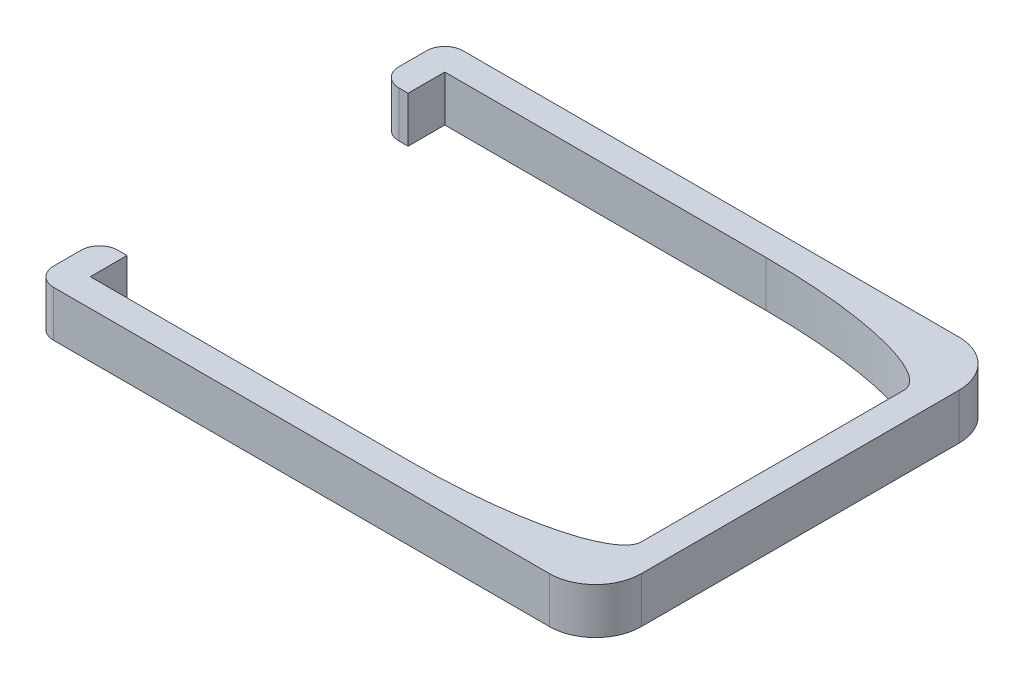
ISO-10303-21;
HEADER;
FILE_DESCRIPTION(('STEP AP214'),'2;1');
FILE_NAME('part.step','',(''),(''),'','','');
FILE_SCHEMA(('AUTOMOTIVE_DESIGN { 1 0 10303 214 1 1 1 1 }'));
ENDSEC;
DATA;
#1=APPLICATION_CONTEXT('core data for automotive mechanical design processes');
#2=APPLICATION_PROTOCOL_DEFINITION('international standard','automotive_design',2000,#1);
#3=PRODUCT_CONTEXT('',#1,'mechanical');
#4=PRODUCT('Part','Part','',(#3));
#5=PRODUCT_RELATED_PRODUCT_CATEGORY('part','',(#4));
#6=PRODUCT_DEFINITION_FORMATION('','',#4);
#7=PRODUCT_DEFINITION_CONTEXT('part definition',#1,'design');
#8=PRODUCT_DEFINITION('design','',#6,#7);
#9=PRODUCT_DEFINITION_SHAPE('','',#8);
#10=(LENGTH_UNIT() NAMED_UNIT(*) SI_UNIT(.MILLI.,.METRE.));
#11=(NAMED_UNIT(*) PLANE_ANGLE_UNIT() SI_UNIT($,.RADIAN.));
#12=(NAMED_UNIT(*) SI_UNIT($,.STERADIAN.) SOLID_ANGLE_UNIT());
#13=UNCERTAINTY_MEASURE_WITH_UNIT(LENGTH_MEASURE(1.E-05),#10,'distance_accuracy_value','');
#14=(GEOMETRIC_REPRESENTATION_CONTEXT(3) GLOBAL_UNCERTAINTY_ASSIGNED_CONTEXT((#13)) GLOBAL_UNIT_ASSIGNED_CONTEXT((#10,
#11,#12)) REPRESENTATION_CONTEXT('',''));
#15=CARTESIAN_POINT('',(0.,0.,0.));
#16=DIRECTION('',(0.,0.,1.));
#17=DIRECTION('',(1.,0.,0.));
#18=AXIS2_PLACEMENT_3D('',#15,#16,#17);
#19=CARTESIAN_POINT('',(0.,5.,4.));
#20=DIRECTION('',(-1.,0.,0.));
#21=DIRECTION('',(0.,0.,1.));
#22=AXIS2_PLACEMENT_3D('',#19,#20,#21);
#23=PLANE('',#22);
#24=DIRECTION('',(0.,0.,-1.));
#25=VECTOR('',#24,1.);
#26=CARTESIAN_POINT('',(0.,0.,4.));
#27=LINE('',#26,#25);
#28=CARTESIAN_POINT('',(0.,0.,4.));
#29=VERTEX_POINT('',#28);
#30=CARTESIAN_POINT('',(0.,0.,0.));
#31=VERTEX_POINT('',#30);
#32=EDGE_CURVE('E212',#29,#31,#27,.T.);
#33=ORIENTED_EDGE('',*,*,#32,.T.);
#34=DIRECTION('',(0.,-1.,0.));
#35=VECTOR('',#34,1.);
#36=CARTESIAN_POINT('',(0.,5.,0.));
#37=LINE('',#36,#35);
#38=CARTESIAN_POINT('',(0.,5.,0.));
#39=VERTEX_POINT('',#38);
#40=EDGE_CURVE('E191',#39,#31,#37,.T.);
#41=ORIENTED_EDGE('',*,*,#40,.F.);
#42=DIRECTION('',(0.,0.,-1.));
#43=VECTOR('',#42,1.);
#44=CARTESIAN_POINT('',(0.,5.,4.));
#45=LINE('',#44,#43);
#46=CARTESIAN_POINT('',(0.,5.,4.));
#47=VERTEX_POINT('',#46);
#48=EDGE_CURVE('E199',#47,#39,#45,.T.);
#49=ORIENTED_EDGE('',*,*,#48,.F.);
#50=DIRECTION('',(0.,-1.,0.));
#51=VECTOR('',#50,1.);
#52=CARTESIAN_POINT('',(0.,5.,4.));
#53=LINE('',#52,#51);
#54=EDGE_CURVE('E285',#47,#29,#53,.T.);
#55=ORIENTED_EDGE('',*,*,#54,.T.);
#56=EDGE_LOOP('',(#33,#41,#49,#55));
#57=FACE_BOUND('',#56,.T.);
#58=ADVANCED_FACE('F45',(#57),#23,.F.);
#59=CARTESIAN_POINT('',(0.,5.,0.));
#60=DIRECTION('',(0.,0.,-1.));
#61=DIRECTION('',(-1.,0.,0.));
#62=AXIS2_PLACEMENT_3D('',#59,#60,#61);
#63=PLANE('',#62);
#64=DIRECTION('',(1.,0.,0.));
#65=VECTOR('',#64,1.);
#66=CARTESIAN_POINT('',(0.,0.,0.));
#67=LINE('',#66,#65);
#68=CARTESIAN_POINT('',(35.,0.,0.));
#69=VERTEX_POINT('',#68);
#70=EDGE_CURVE('E231',#31,#69,#67,.T.);
#71=ORIENTED_EDGE('',*,*,#70,.T.);
#72=CARTESIAN_POINT('',(35.,5.25,0.));
#73=CARTESIAN_POINT('',(35.,3.41666666666667,0.));
#74=CARTESIAN_POINT('',(35.,1.58333333333333,0.));
#75=CARTESIAN_POINT('',(35.,-0.25,0.));
#76=(BOUNDED_CURVE() B_SPLINE_CURVE(3,(#72,#73,#74,#75),.UNSPECIFIED.,.F.,
.F.) B_SPLINE_CURVE_WITH_KNOTS((4,4),(-0.00525,0.00025),
.UNSPECIFIED.) CURVE() GEOMETRIC_REPRESENTATION_ITEM() RATIONAL_B_SPLINE_CURVE((1.,1.,1.,1.)) REPRESENTATION_ITEM(''));
#77=CARTESIAN_POINT('',(35.,5.,0.));
#78=VERTEX_POINT('',#77);
#79=EDGE_CURVE('E194',#69,#78,#76,.F.);
#80=ORIENTED_EDGE('',*,*,#79,.T.);
#81=DIRECTION('',(1.,0.,0.));
#82=VECTOR('',#81,1.);
#83=CARTESIAN_POINT('',(0.,5.,0.));
#84=LINE('',#83,#82);
#85=EDGE_CURVE('E186',#39,#78,#84,.T.);
#86=ORIENTED_EDGE('',*,*,#85,.F.);
#87=ORIENTED_EDGE('',*,*,#40,.T.);
#88=EDGE_LOOP('',(#71,#80,#86,#87));
#89=FACE_BOUND('',#88,.T.);
#90=ADVANCED_FACE('F189',(#89),#63,.F.);
#91=CARTESIAN_POINT('',(55.,5.,0.));
#92=DIRECTION('',(1.,0.,0.));
#93=DIRECTION('',(0.,0.,-1.));
#94=AXIS2_PLACEMENT_3D('',#91,#92,#93);
#95=PLANE('',#94);
#96=DIRECTION('',(0.,0.,1.));
#97=VECTOR('',#96,1.);
#98=CARTESIAN_POINT('',(55.,5.,0.));
#99=LINE('',#98,#97);
#100=CARTESIAN_POINT('',(55.,5.,4.99999999999999));
#101=VERTEX_POINT('',#100);
#102=CARTESIAN_POINT('',(55.,5.,33.6));
#103=VERTEX_POINT('',#102);
#104=EDGE_CURVE('E198',#101,#103,#99,.T.);
#105=ORIENTED_EDGE('',*,*,#104,.F.);
#106=CARTESIAN_POINT('',(55.,-0.25,4.99999999999999));
#107=CARTESIAN_POINT('',(55.,1.58333333333333,4.99999999999999));
#108=CARTESIAN_POINT('',(55.,3.41666666666667,4.99999999999999));
#109=CARTESIAN_POINT('',(55.,5.25,4.99999999999999));
#110=(BOUNDED_CURVE() B_SPLINE_CURVE(3,(#106,#107,#108,#109),.UNSPECIFIED.,.F.,
.F.) B_SPLINE_CURVE_WITH_KNOTS((4,4),(-0.00525,0.00025),
.UNSPECIFIED.) CURVE() GEOMETRIC_REPRESENTATION_ITEM() RATIONAL_B_SPLINE_CURVE((1.,1.,1.,1.)) REPRESENTATION_ITEM(''));
#111=CARTESIAN_POINT('',(55.,0.,4.99999999999999));
#112=VERTEX_POINT('',#111);
#113=EDGE_CURVE('E219',#101,#112,#110,.F.);
#114=ORIENTED_EDGE('',*,*,#113,.T.);
#115=DIRECTION('',(0.,0.,1.));
#116=VECTOR('',#115,1.);
#117=CARTESIAN_POINT('',(55.,0.,0.));
#118=LINE('',#117,#116);
#119=CARTESIAN_POINT('',(55.,0.,33.6));
#120=VERTEX_POINT('',#119);
#121=EDGE_CURVE('E225',#112,#120,#118,.T.);
#122=ORIENTED_EDGE('',*,*,#121,.T.);
#123=CARTESIAN_POINT('',(55.,5.25,33.6));
#124=CARTESIAN_POINT('',(55.,3.41666666666667,33.6));
#125=CARTESIAN_POINT('',(55.,1.58333333333333,33.6));
#126=CARTESIAN_POINT('',(55.,-0.25,33.6));
#127=(BOUNDED_CURVE() B_SPLINE_CURVE(3,(#123,#124,#125,#126),.UNSPECIFIED.,.F.,
.F.) B_SPLINE_CURVE_WITH_KNOTS((4,4),(-0.00525,0.00025),
.UNSPECIFIED.) CURVE() GEOMETRIC_REPRESENTATION_ITEM() RATIONAL_B_SPLINE_CURVE((1.,1.,1.,1.)) REPRESENTATION_ITEM(''));
#128=EDGE_CURVE('E214',#120,#103,#127,.F.);
#129=ORIENTED_EDGE('',*,*,#128,.T.);
#130=EDGE_LOOP('',(#105,#114,#122,#129));
#131=FACE_BOUND('',#130,.T.);
#132=ADVANCED_FACE('F297',(#131),#95,.F.);
#133=CARTESIAN_POINT('',(55.,5.,38.6));
#134=DIRECTION('',(0.,0.,1.));
#135=DIRECTION('',(1.,0.,0.));
#136=AXIS2_PLACEMENT_3D('',#133,#134,#135);
#137=PLANE('',#136);
#138=DIRECTION('',(-1.,0.,0.));
#139=VECTOR('',#138,1.);
#140=CARTESIAN_POINT('',(55.,5.,38.6));
#141=LINE('',#140,#139);
#142=CARTESIAN_POINT('',(35.,5.,38.6));
#143=VERTEX_POINT('',#142);
#144=CARTESIAN_POINT('',(0.,5.,38.6));
#145=VERTEX_POINT('',#144);
#146=EDGE_CURVE('E250',#143,#145,#141,.T.);
#147=ORIENTED_EDGE('',*,*,#146,.F.);
#148=CARTESIAN_POINT('',(35.,-0.25,38.6));
#149=CARTESIAN_POINT('',(35.,1.58333333333333,38.6));
#150=CARTESIAN_POINT('',(35.,3.41666666666667,38.6));
#151=CARTESIAN_POINT('',(35.,5.25,38.6));
#152=(BOUNDED_CURVE() B_SPLINE_CURVE(3,(#148,#149,#150,#151),.UNSPECIFIED.,.F.,
.F.) B_SPLINE_CURVE_WITH_KNOTS((4,4),(-0.00525,0.00025),
.UNSPECIFIED.) CURVE() GEOMETRIC_REPRESENTATION_ITEM() RATIONAL_B_SPLINE_CURVE((1.,1.,1.,1.)) REPRESENTATION_ITEM(''));
#153=CARTESIAN_POINT('',(35.,0.,38.6));
#154=VERTEX_POINT('',#153);
#155=EDGE_CURVE('E337',#143,#154,#152,.F.);
#156=ORIENTED_EDGE('',*,*,#155,.T.);
#157=DIRECTION('',(-1.,0.,0.));
#158=VECTOR('',#157,1.);
#159=CARTESIAN_POINT('',(55.,0.,38.6));
#160=LINE('',#159,#158);
#161=CARTESIAN_POINT('',(0.,0.,38.6));
#162=VERTEX_POINT('',#161);
#163=EDGE_CURVE('E230',#154,#162,#160,.T.);
#164=ORIENTED_EDGE('',*,*,#163,.T.);
#165=DIRECTION('',(0.,-1.,0.));
#166=VECTOR('',#165,1.);
#167=CARTESIAN_POINT('',(0.,5.,38.6));
#168=LINE('',#167,#166);
#169=EDGE_CURVE('E215',#145,#162,#168,.T.);
#170=ORIENTED_EDGE('',*,*,#169,.F.);
#171=EDGE_LOOP('',(#147,#156,#164,#170));
#172=FACE_BOUND('',#171,.T.);
#173=ADVANCED_FACE('F306',(#172),#137,.F.);
#174=CARTESIAN_POINT('',(0.,5.,38.6));
#175=DIRECTION('',(-1.,0.,0.));
#176=DIRECTION('',(0.,0.,1.));
#177=AXIS2_PLACEMENT_3D('',#174,#175,#176);
#178=PLANE('',#177);
#179=DIRECTION('',(0.,0.,-1.));
#180=VECTOR('',#179,1.);
#181=CARTESIAN_POINT('',(0.,0.,38.6));
#182=LINE('',#181,#180);
#183=CARTESIAN_POINT('',(0.,0.,34.6));
#184=VERTEX_POINT('',#183);
#185=EDGE_CURVE('E241',#162,#184,#182,.T.);
#186=ORIENTED_EDGE('',*,*,#185,.T.);
#187=DIRECTION('',(0.,-1.,0.));
#188=VECTOR('',#187,1.);
#189=CARTESIAN_POINT('',(0.,5.,34.6));
#190=LINE('',#189,#188);
#191=CARTESIAN_POINT('',(0.,5.,34.6));
#192=VERTEX_POINT('',#191);
#193=EDGE_CURVE('E221',#192,#184,#190,.T.);
#194=ORIENTED_EDGE('',*,*,#193,.F.);
#195=DIRECTION('',(0.,0.,-1.));
#196=VECTOR('',#195,1.);
#197=CARTESIAN_POINT('',(0.,5.,38.6));
#198=LINE('',#197,#196);
#199=EDGE_CURVE('E254',#145,#192,#198,.T.);
#200=ORIENTED_EDGE('',*,*,#199,.F.);
#201=ORIENTED_EDGE('',*,*,#169,.T.);
#202=EDGE_LOOP('',(#186,#194,#200,#201));
#203=FACE_BOUND('',#202,.T.);
#204=ADVANCED_FACE('F529',(#203),#178,.F.);
#205=CARTESIAN_POINT('',(0.,5.,34.6));
#206=DIRECTION('',(0.,0.,1.));
#207=DIRECTION('',(1.,0.,0.));
#208=AXIS2_PLACEMENT_3D('',#205,#206,#207);
#209=PLANE('',#208);
#210=DIRECTION('',(-1.,0.,0.));
#211=VECTOR('',#210,1.);
#212=CARTESIAN_POINT('',(0.,0.,34.6));
#213=LINE('',#212,#211);
#214=CARTESIAN_POINT('',(-1.,0.,34.6));
#215=VERTEX_POINT('',#214);
#216=EDGE_CURVE('E501',#184,#215,#213,.T.);
#217=ORIENTED_EDGE('',*,*,#216,.T.);
#218=DIRECTION('',(0.,-1.,0.));
#219=VECTOR('',#218,1.);
#220=CARTESIAN_POINT('',(-1.,5.,34.6));
#221=LINE('',#220,#219);
#222=CARTESIAN_POINT('',(-1.,5.,34.6));
#223=VERTEX_POINT('',#222);
#224=EDGE_CURVE('E425',#215,#223,#221,.F.);
#225=ORIENTED_EDGE('',*,*,#224,.T.);
#226=DIRECTION('',(-1.,0.,0.));
#227=VECTOR('',#226,1.);
#228=CARTESIAN_POINT('',(0.,5.,34.6));
#229=LINE('',#228,#227);
#230=EDGE_CURVE('E263',#192,#223,#229,.T.);
#231=ORIENTED_EDGE('',*,*,#230,.F.);
#232=ORIENTED_EDGE('',*,*,#193,.T.);
#233=EDGE_LOOP('',(#217,#225,#231,#232));
#234=FACE_BOUND('',#233,.T.);
#235=ADVANCED_FACE('F520',(#234),#209,.F.);
#236=CARTESIAN_POINT('',(-3.,5.,34.6));
#237=DIRECTION('',(1.,0.,0.));
#238=DIRECTION('',(0.,0.,-1.));
#239=AXIS2_PLACEMENT_3D('',#236,#237,#238);
#240=PLANE('',#239);
#241=DIRECTION('',(0.,0.,1.));
#242=VECTOR('',#241,1.);
#243=CARTESIAN_POINT('',(-3.,5.,34.6));
#244=LINE('',#243,#242);
#245=CARTESIAN_POINT('',(-3.,5.,36.6));
#246=VERTEX_POINT('',#245);
#247=CARTESIAN_POINT('',(-3.,5.,39.6));
#248=VERTEX_POINT('',#247);
#249=EDGE_CURVE('E267',#246,#248,#244,.T.);
#250=ORIENTED_EDGE('',*,*,#249,.F.);
#251=DIRECTION('',(0.,-1.,0.));
#252=VECTOR('',#251,1.);
#253=CARTESIAN_POINT('',(-3.,5.,36.6));
#254=LINE('',#253,#252);
#255=CARTESIAN_POINT('',(-3.,0.,36.6));
#256=VERTEX_POINT('',#255);
#257=EDGE_CURVE('E408',#246,#256,#254,.T.);
#258=ORIENTED_EDGE('',*,*,#257,.T.);
#259=DIRECTION('',(0.,0.,1.));
#260=VECTOR('',#259,1.);
#261=CARTESIAN_POINT('',(-3.,0.,34.6));
#262=LINE('',#261,#260);
#263=CARTESIAN_POINT('',(-3.,0.,39.6));
#264=VERTEX_POINT('',#263);
#265=EDGE_CURVE('E494',#256,#264,#262,.T.);
#266=ORIENTED_EDGE('',*,*,#265,.T.);
#267=DIRECTION('',(0.,-1.,0.));
#268=VECTOR('',#267,1.);
#269=CARTESIAN_POINT('',(-3.,5.,39.6));
#270=LINE('',#269,#268);
#271=EDGE_CURVE('E340',#264,#248,#270,.F.);
#272=ORIENTED_EDGE('',*,*,#271,.T.);
#273=EDGE_LOOP('',(#250,#258,#266,#272));
#274=FACE_BOUND('',#273,.T.);
#275=ADVANCED_FACE('F650',(#274),#240,.F.);
#276=CARTESIAN_POINT('',(1.50000000000003,5.,41.6));
#277=DIRECTION('',(0.,0.,-1.));
#278=DIRECTION('',(-1.,0.,0.));
#279=AXIS2_PLACEMENT_3D('',#276,#277,#278);
#280=PLANE('',#279);
#281=DIRECTION('',(1.,0.,0.));
#282=VECTOR('',#281,1.);
#283=CARTESIAN_POINT('',(1.50000000000003,0.,41.6));
#284=LINE('',#283,#282);
#285=CARTESIAN_POINT('',(-1.,0.,41.6));
#286=VERTEX_POINT('',#285);
#287=CARTESIAN_POINT('',(53.,0.,41.6));
#288=VERTEX_POINT('',#287);
#289=EDGE_CURVE('E489',#286,#288,#284,.T.);
#290=ORIENTED_EDGE('',*,*,#289,.T.);
#291=DIRECTION('',(0.,-1.,0.));
#292=VECTOR('',#291,1.);
#293=CARTESIAN_POINT('',(53.,5.,41.6));
#294=LINE('',#293,#292);
#295=CARTESIAN_POINT('',(53.,5.,41.6));
#296=VERTEX_POINT('',#295);
#297=EDGE_CURVE('E69',#288,#296,#294,.F.);
#298=ORIENTED_EDGE('',*,*,#297,.T.);
#299=DIRECTION('',(1.,0.,0.));
#300=VECTOR('',#299,1.);
#301=CARTESIAN_POINT('',(-3.,5.,41.6));
#302=LINE('',#301,#300);
#303=CARTESIAN_POINT('',(-1.,5.,41.6));
#304=VERTEX_POINT('',#303);
#305=EDGE_CURVE('E271',#304,#296,#302,.T.);
#306=ORIENTED_EDGE('',*,*,#305,.F.);
#307=DIRECTION('',(0.,-1.,0.));
#308=VECTOR('',#307,1.);
#309=CARTESIAN_POINT('',(-1.,5.,41.6));
#310=LINE('',#309,#308);
#311=EDGE_CURVE('E455',#304,#286,#310,.T.);
#312=ORIENTED_EDGE('',*,*,#311,.T.);
#313=EDGE_LOOP('',(#290,#298,#306,#312));
#314=FACE_BOUND('',#313,.T.);
#315=ADVANCED_FACE('F491',(#314),#280,.F.);
#316=CARTESIAN_POINT('',(58.,5.,41.6));
#317=DIRECTION('',(-1.,0.,0.));
#318=DIRECTION('',(0.,0.,1.));
#319=AXIS2_PLACEMENT_3D('',#316,#317,#318);
#320=PLANE('',#319);
#321=DIRECTION('',(0.,0.,-1.));
#322=VECTOR('',#321,1.);
#323=CARTESIAN_POINT('',(58.,5.,41.6));
#324=LINE('',#323,#322);
#325=CARTESIAN_POINT('',(58.,5.,36.6));
#326=VERTEX_POINT('',#325);
#327=CARTESIAN_POINT('',(58.,5.,2.));
#328=VERTEX_POINT('',#327);
#329=EDGE_CURVE('E274',#326,#328,#324,.T.);
#330=ORIENTED_EDGE('',*,*,#329,.F.);
#331=DIRECTION('',(0.,-1.,0.));
#332=VECTOR('',#331,1.);
#333=CARTESIAN_POINT('',(58.,5.,36.6));
#334=LINE('',#333,#332);
#335=CARTESIAN_POINT('',(58.,0.,36.6));
#336=VERTEX_POINT('',#335);
#337=EDGE_CURVE('E462',#326,#336,#334,.T.);
#338=ORIENTED_EDGE('',*,*,#337,.T.);
#339=DIRECTION('',(0.,0.,-1.));
#340=VECTOR('',#339,1.);
#341=CARTESIAN_POINT('',(58.,0.,41.6));
#342=LINE('',#341,#340);
#343=CARTESIAN_POINT('',(58.,0.,2.));
#344=VERTEX_POINT('',#343);
#345=EDGE_CURVE('E490',#336,#344,#342,.T.);
#346=ORIENTED_EDGE('',*,*,#345,.T.);
#347=DIRECTION('',(0.,-1.,0.));
#348=VECTOR('',#347,1.);
#349=CARTESIAN_POINT('',(58.,5.,2.));
#350=LINE('',#349,#348);
#351=EDGE_CURVE('E459',#344,#328,#350,.F.);
#352=ORIENTED_EDGE('',*,*,#351,.T.);
#353=EDGE_LOOP('',(#330,#338,#346,#352));
#354=FACE_BOUND('',#353,.T.);
#355=ADVANCED_FACE('F481',(#354),#320,.F.);
#356=CARTESIAN_POINT('',(0.,5.,-2.99999999999999));
#357=DIRECTION('',(0.,0.,1.));
#358=DIRECTION('',(1.,0.,0.));
#359=AXIS2_PLACEMENT_3D('',#356,#357,#358);
#360=PLANE('',#359);
#361=DIRECTION('',(-1.,0.,0.));
#362=VECTOR('',#361,1.);
#363=CARTESIAN_POINT('',(58.,5.,-3.));
#364=LINE('',#363,#362);
#365=CARTESIAN_POINT('',(53.,5.,-3.));
#366=VERTEX_POINT('',#365);
#367=CARTESIAN_POINT('',(-0.999999999999987,5.,-2.99999999999999));
#368=VERTEX_POINT('',#367);
#369=EDGE_CURVE('E277',#366,#368,#364,.T.);
#370=ORIENTED_EDGE('',*,*,#369,.F.);
#371=DIRECTION('',(0.,-1.,0.));
#372=VECTOR('',#371,1.);
#373=CARTESIAN_POINT('',(53.,5.,-3.));
#374=LINE('',#373,#372);
#375=CARTESIAN_POINT('',(53.,0.,-3.));
#376=VERTEX_POINT('',#375);
#377=EDGE_CURVE('E12',#366,#376,#374,.T.);
#378=ORIENTED_EDGE('',*,*,#377,.T.);
#379=DIRECTION('',(-1.,0.,0.));
#380=VECTOR('',#379,1.);
#381=CARTESIAN_POINT('',(0.,0.,-2.99999999999999));
#382=LINE('',#381,#380);
#383=CARTESIAN_POINT('',(-1.,0.,-2.99999999999999));
#384=VERTEX_POINT('',#383);
#385=EDGE_CURVE('E498',#376,#384,#382,.T.);
#386=ORIENTED_EDGE('',*,*,#385,.T.);
#387=DIRECTION('',(0.,-1.,0.));
#388=VECTOR('',#387,1.);
#389=CARTESIAN_POINT('',(-1.,5.,-2.99999999999999));
#390=LINE('',#389,#388);
#391=EDGE_CURVE('E451',#384,#368,#390,.F.);
#392=ORIENTED_EDGE('',*,*,#391,.T.);
#393=EDGE_LOOP('',(#370,#378,#386,#392));
#394=FACE_BOUND('',#393,.T.);
#395=ADVANCED_FACE('F673',(#394),#360,.F.);
#396=CARTESIAN_POINT('',(-3.,5.,-2.99999999999999));
#397=DIRECTION('',(1.,0.,0.));
#398=DIRECTION('',(0.,0.,-1.));
#399=AXIS2_PLACEMENT_3D('',#396,#397,#398);
#400=PLANE('',#399);
#401=DIRECTION('',(0.,0.,1.));
#402=VECTOR('',#401,1.);
#403=CARTESIAN_POINT('',(-3.,0.,-2.99999999999999));
#404=LINE('',#403,#402);
#405=CARTESIAN_POINT('',(-3.,0.,-0.999999999999994));
#406=VERTEX_POINT('',#405);
#407=CARTESIAN_POINT('',(-3.,0.,2.));
#408=VERTEX_POINT('',#407);
#409=EDGE_CURVE('E506',#406,#408,#404,.T.);
#410=ORIENTED_EDGE('',*,*,#409,.T.);
#411=DIRECTION('',(0.,-1.,0.));
#412=VECTOR('',#411,1.);
#413=CARTESIAN_POINT('',(-3.,5.,2.));
#414=LINE('',#413,#412);
#415=CARTESIAN_POINT('',(-3.,5.,2.));
#416=VERTEX_POINT('',#415);
#417=EDGE_CURVE('E448',#408,#416,#414,.F.);
#418=ORIENTED_EDGE('',*,*,#417,.T.);
#419=DIRECTION('',(0.,0.,1.));
#420=VECTOR('',#419,1.);
#421=CARTESIAN_POINT('',(-3.,5.,-2.99999999999999));
#422=LINE('',#421,#420);
#423=CARTESIAN_POINT('',(-3.,5.,-0.999999999999994));
#424=VERTEX_POINT('',#423);
#425=EDGE_CURVE('E280',#424,#416,#422,.T.);
#426=ORIENTED_EDGE('',*,*,#425,.F.);
#427=DIRECTION('',(0.,-1.,0.));
#428=VECTOR('',#427,1.);
#429=CARTESIAN_POINT('',(-3.,5.,-0.999999999999993));
#430=LINE('',#429,#428);
#431=EDGE_CURVE('E444',#424,#406,#430,.T.);
#432=ORIENTED_EDGE('',*,*,#431,.T.);
#433=EDGE_LOOP('',(#410,#418,#426,#432));
#434=FACE_BOUND('',#433,.T.);
#435=ADVANCED_FACE('F680',(#434),#400,.F.);
#436=CARTESIAN_POINT('',(-3.,5.,4.));
#437=DIRECTION('',(0.,0.,-1.));
#438=DIRECTION('',(-1.,0.,0.));
#439=AXIS2_PLACEMENT_3D('',#436,#437,#438);
#440=PLANE('',#439);
#441=DIRECTION('',(1.,0.,0.));
#442=VECTOR('',#441,1.);
#443=CARTESIAN_POINT('',(-3.,5.,4.));
#444=LINE('',#443,#442);
#445=CARTESIAN_POINT('',(-1.,5.,4.));
#446=VERTEX_POINT('',#445);
#447=EDGE_CURVE('E204',#446,#47,#444,.T.);
#448=ORIENTED_EDGE('',*,*,#447,.F.);
#449=DIRECTION('',(0.,-1.,0.));
#450=VECTOR('',#449,1.);
#451=CARTESIAN_POINT('',(-1.,5.,4.));
#452=LINE('',#451,#450);
#453=CARTESIAN_POINT('',(-1.,0.,4.));
#454=VERTEX_POINT('',#453);
#455=EDGE_CURVE('E440',#446,#454,#452,.T.);
#456=ORIENTED_EDGE('',*,*,#455,.T.);
#457=DIRECTION('',(1.,0.,0.));
#458=VECTOR('',#457,1.);
#459=CARTESIAN_POINT('',(-3.,0.,4.));
#460=LINE('',#459,#458);
#461=EDGE_CURVE('E209',#454,#29,#460,.T.);
#462=ORIENTED_EDGE('',*,*,#461,.T.);
#463=ORIENTED_EDGE('',*,*,#54,.F.);
#464=EDGE_LOOP('',(#448,#456,#462,#463));
#465=FACE_BOUND('',#464,.T.);
#466=ADVANCED_FACE('F552',(#465),#440,.F.);
#467=CARTESIAN_POINT('',(0.,5.,0.));
#468=DIRECTION('',(0.,-1.,0.));
#469=DIRECTION('',(0.,0.,-1.));
#470=AXIS2_PLACEMENT_3D('',#467,#468,#469);
#471=PLANE('',#470);
#472=ORIENTED_EDGE('',*,*,#305,.T.);
#473=CARTESIAN_POINT('',(53.,5.,36.6));
#474=DIRECTION('',(0.,-1.,0.));
#475=DIRECTION('',(0.,0.,-1.));
#476=AXIS2_PLACEMENT_3D('',#473,#474,#475);
#477=CIRCLE('',#476,5.);
#478=EDGE_CURVE('E54',#296,#326,#477,.F.);
#479=ORIENTED_EDGE('',*,*,#478,.T.);
#480=ORIENTED_EDGE('',*,*,#329,.T.);
#481=CARTESIAN_POINT('',(53.,5.,2.));
#482=DIRECTION('',(0.,-1.,0.));
#483=DIRECTION('',(0.,0.,-1.));
#484=AXIS2_PLACEMENT_3D('',#481,#482,#483);
#485=CIRCLE('',#484,5.);
#486=EDGE_CURVE('E61',#328,#366,#485,.F.);
#487=ORIENTED_EDGE('',*,*,#486,.T.);
#488=ORIENTED_EDGE('',*,*,#369,.T.);
#489=CARTESIAN_POINT('',(-1.,5.,-0.999999999999993));
#490=DIRECTION('',(0.,-1.,0.));
#491=DIRECTION('',(0.,0.,-1.));
#492=AXIS2_PLACEMENT_3D('',#489,#490,#491);
#493=CIRCLE('',#492,2.);
#494=EDGE_CURVE('E431',#368,#424,#493,.F.);
#495=ORIENTED_EDGE('',*,*,#494,.T.);
#496=ORIENTED_EDGE('',*,*,#425,.T.);
#497=CARTESIAN_POINT('',(-1.,5.,2.));
#498=DIRECTION('',(0.,-1.,0.));
#499=DIRECTION('',(0.,0.,-1.));
#500=AXIS2_PLACEMENT_3D('',#497,#498,#499);
#501=CIRCLE('',#500,2.);
#502=EDGE_CURVE('E434',#416,#446,#501,.F.);
#503=ORIENTED_EDGE('',*,*,#502,.T.);
#504=ORIENTED_EDGE('',*,*,#447,.T.);
#505=ORIENTED_EDGE('',*,*,#48,.T.);
#506=ORIENTED_EDGE('',*,*,#85,.T.);
#507=CARTESIAN_POINT('',(55.,5.,4.99999999999999));
#508=CARTESIAN_POINT('',(55.,5.,0.));
#509=CARTESIAN_POINT('',(35.,5.,0.));
#510=(BOUNDED_CURVE() B_SPLINE_CURVE(2,(#507,#508,#509),.UNSPECIFIED.,.F.,
.F.) B_SPLINE_CURVE_WITH_KNOTS((3,3),(0.,1.),
.UNSPECIFIED.) CURVE() GEOMETRIC_REPRESENTATION_ITEM() RATIONAL_B_SPLINE_CURVE((1.,
0.707106781186548,1.)) REPRESENTATION_ITEM(''));
#511=EDGE_CURVE('E331',#78,#101,#510,.F.);
#512=ORIENTED_EDGE('',*,*,#511,.T.);
#513=ORIENTED_EDGE('',*,*,#104,.T.);
#514=CARTESIAN_POINT('',(35.,5.,38.6));
#515=CARTESIAN_POINT('',(55.,5.,38.6));
#516=CARTESIAN_POINT('',(55.,5.,33.6));
#517=(BOUNDED_CURVE() B_SPLINE_CURVE(2,(#514,#515,#516),.UNSPECIFIED.,.F.,
.F.) B_SPLINE_CURVE_WITH_KNOTS((3,3),(0.,1.),
.UNSPECIFIED.) CURVE() GEOMETRIC_REPRESENTATION_ITEM() RATIONAL_B_SPLINE_CURVE((1.,
0.707106781186547,1.)) REPRESENTATION_ITEM(''));
#518=EDGE_CURVE('E328',#103,#143,#517,.F.);
#519=ORIENTED_EDGE('',*,*,#518,.T.);
#520=ORIENTED_EDGE('',*,*,#146,.T.);
#521=ORIENTED_EDGE('',*,*,#199,.T.);
#522=ORIENTED_EDGE('',*,*,#230,.T.);
#523=CARTESIAN_POINT('',(-1.,5.,36.6));
#524=DIRECTION('',(0.,-1.,0.));
#525=DIRECTION('',(0.,0.,-1.));
#526=AXIS2_PLACEMENT_3D('',#523,#524,#525);
#527=CIRCLE('',#526,2.);
#528=EDGE_CURVE('E437',#223,#246,#527,.F.);
#529=ORIENTED_EDGE('',*,*,#528,.T.);
#530=ORIENTED_EDGE('',*,*,#249,.T.);
#531=CARTESIAN_POINT('',(-1.,5.,39.6));
#532=DIRECTION('',(0.,-1.,0.));
#533=DIRECTION('',(0.,0.,-1.));
#534=AXIS2_PLACEMENT_3D('',#531,#532,#533);
#535=CIRCLE('',#534,2.);
#536=EDGE_CURVE('E428',#248,#304,#535,.F.);
#537=ORIENTED_EDGE('',*,*,#536,.T.);
#538=EDGE_LOOP('',(#472,#479,#480,#487,#488,#495,#496,#503,#504,#505,#506,#512,#513,#519,#520,
#521,#522,#529,#530,#537));
#539=FACE_BOUND('',#538,.T.);
#540=ADVANCED_FACE('F202',(#539),#471,.F.);
#541=CARTESIAN_POINT('',(0.,0.,0.));
#542=DIRECTION('',(0.,-1.,0.));
#543=DIRECTION('',(0.,0.,-1.));
#544=AXIS2_PLACEMENT_3D('',#541,#542,#543);
#545=PLANE('',#544);
#546=ORIENTED_EDGE('',*,*,#345,.F.);
#547=CARTESIAN_POINT('',(53.,0.,36.6));
#548=DIRECTION('',(0.,-1.,0.));
#549=DIRECTION('',(0.,0.,-1.));
#550=AXIS2_PLACEMENT_3D('',#547,#548,#549);
#551=CIRCLE('',#550,5.);
#552=EDGE_CURVE('E469',#336,#288,#551,.T.);
#553=ORIENTED_EDGE('',*,*,#552,.T.);
#554=ORIENTED_EDGE('',*,*,#289,.F.);
#555=CARTESIAN_POINT('',(-1.,0.,39.6));
#556=DIRECTION('',(0.,-1.,0.));
#557=DIRECTION('',(0.,0.,-1.));
#558=AXIS2_PLACEMENT_3D('',#555,#556,#557);
#559=CIRCLE('',#558,2.);
#560=EDGE_CURVE('E412',#286,#264,#559,.T.);
#561=ORIENTED_EDGE('',*,*,#560,.T.);
#562=ORIENTED_EDGE('',*,*,#265,.F.);
#563=CARTESIAN_POINT('',(-1.,0.,36.6));
#564=DIRECTION('',(0.,-1.,0.));
#565=DIRECTION('',(0.,0.,-1.));
#566=AXIS2_PLACEMENT_3D('',#563,#564,#565);
#567=CIRCLE('',#566,2.);
#568=EDGE_CURVE('E422',#256,#215,#567,.T.);
#569=ORIENTED_EDGE('',*,*,#568,.T.);
#570=ORIENTED_EDGE('',*,*,#216,.F.);
#571=ORIENTED_EDGE('',*,*,#185,.F.);
#572=ORIENTED_EDGE('',*,*,#163,.F.);
#573=CARTESIAN_POINT('',(55.,0.,33.6));
#574=CARTESIAN_POINT('',(55.,0.,38.6));
#575=CARTESIAN_POINT('',(35.,0.,38.6));
#576=(BOUNDED_CURVE() B_SPLINE_CURVE(2,(#573,#574,#575),.UNSPECIFIED.,.F.,
.F.) B_SPLINE_CURVE_WITH_KNOTS((3,3),(0.,1.),
.UNSPECIFIED.) CURVE() GEOMETRIC_REPRESENTATION_ITEM() RATIONAL_B_SPLINE_CURVE((1.,
0.707106781186547,1.)) REPRESENTATION_ITEM(''));
#577=EDGE_CURVE('E341',#154,#120,#576,.F.);
#578=ORIENTED_EDGE('',*,*,#577,.T.);
#579=ORIENTED_EDGE('',*,*,#121,.F.);
#580=CARTESIAN_POINT('',(35.,0.,0.));
#581=CARTESIAN_POINT('',(55.,0.,0.));
#582=CARTESIAN_POINT('',(55.,0.,4.99999999999999));
#583=(BOUNDED_CURVE() B_SPLINE_CURVE(2,(#580,#581,#582),.UNSPECIFIED.,.F.,
.F.) B_SPLINE_CURVE_WITH_KNOTS((3,3),(0.,1.),
.UNSPECIFIED.) CURVE() GEOMETRIC_REPRESENTATION_ITEM() RATIONAL_B_SPLINE_CURVE((1.,
0.707106781186548,1.)) REPRESENTATION_ITEM(''));
#584=EDGE_CURVE('E564',#112,#69,#583,.F.);
#585=ORIENTED_EDGE('',*,*,#584,.T.);
#586=ORIENTED_EDGE('',*,*,#70,.F.);
#587=ORIENTED_EDGE('',*,*,#32,.F.);
#588=ORIENTED_EDGE('',*,*,#461,.F.);
#589=CARTESIAN_POINT('',(-1.,0.,2.));
#590=DIRECTION('',(0.,-1.,0.));
#591=DIRECTION('',(0.,0.,-1.));
#592=AXIS2_PLACEMENT_3D('',#589,#590,#591);
#593=CIRCLE('',#592,2.);
#594=EDGE_CURVE('E419',#454,#408,#593,.T.);
#595=ORIENTED_EDGE('',*,*,#594,.T.);
#596=ORIENTED_EDGE('',*,*,#409,.F.);
#597=CARTESIAN_POINT('',(-1.,0.,-0.999999999999993));
#598=DIRECTION('',(0.,-1.,0.));
#599=DIRECTION('',(0.,0.,-1.));
#600=AXIS2_PLACEMENT_3D('',#597,#598,#599);
#601=CIRCLE('',#600,2.);
#602=EDGE_CURVE('E415',#406,#384,#601,.T.);
#603=ORIENTED_EDGE('',*,*,#602,.T.);
#604=ORIENTED_EDGE('',*,*,#385,.F.);
#605=CARTESIAN_POINT('',(53.,0.,2.));
#606=DIRECTION('',(0.,-1.,0.));
#607=DIRECTION('',(0.,0.,-1.));
#608=AXIS2_PLACEMENT_3D('',#605,#606,#607);
#609=CIRCLE('',#608,5.);
#610=EDGE_CURVE('E466',#376,#344,#609,.T.);
#611=ORIENTED_EDGE('',*,*,#610,.T.);
#612=EDGE_LOOP('',(#546,#553,#554,#561,#562,#569,#570,#571,#572,#578,#579,#585,#586,#587,#588,
#595,#596,#603,#604,#611));
#613=FACE_BOUND('',#612,.T.);
#614=ADVANCED_FACE('F488',(#613),#545,.T.);
#615=CARTESIAN_POINT('',(35.,-0.25,0.));
#616=CARTESIAN_POINT('',(35.,1.58333333333333,0.));
#617=CARTESIAN_POINT('',(35.,3.41666666666667,0.));
#618=CARTESIAN_POINT('',(35.,5.25,0.));
#619=CARTESIAN_POINT('',(55.,-0.25,0.));
#620=CARTESIAN_POINT('',(55.,1.58333333333333,0.));
#621=CARTESIAN_POINT('',(55.,3.41666666666667,0.));
#622=CARTESIAN_POINT('',(55.,5.25,0.));
#623=CARTESIAN_POINT('',(55.,-0.25,4.99999999999999));
#624=CARTESIAN_POINT('',(55.,1.58333333333333,4.99999999999999));
#625=CARTESIAN_POINT('',(55.,3.41666666666667,4.99999999999999));
#626=CARTESIAN_POINT('',(55.,5.25,4.99999999999999));
#627=(BOUNDED_SURFACE() B_SPLINE_SURFACE(2,3,((#615,#616,#617,#618),(#619,#620,#621,#622),(#623,
#624,#625,#626)),.UNSPECIFIED.,.F.,.F.,.F.) B_SPLINE_SURFACE_WITH_KNOTS((3,3),(4,4),(0.,1.),
(-0.00525,0.00025),
.UNSPECIFIED.) GEOMETRIC_REPRESENTATION_ITEM() RATIONAL_B_SPLINE_SURFACE(((1.,1.,1.,1.),
(0.707106781186548,0.707106781186548,0.707106781186548,0.707106781186548),(1.,1.,1.,1.))) REPRESENTATION_ITEM('') SURFACE());
#628=ORIENTED_EDGE('',*,*,#511,.F.);
#629=ORIENTED_EDGE('',*,*,#79,.F.);
#630=ORIENTED_EDGE('',*,*,#584,.F.);
#631=ORIENTED_EDGE('',*,*,#113,.F.);
#632=EDGE_LOOP('',(#628,#629,#630,#631));
#633=FACE_BOUND('',#632,.T.);
#634=ADVANCED_FACE('F365',(#633),#627,.T.);
#635=CARTESIAN_POINT('',(55.,-0.25,33.6));
#636=CARTESIAN_POINT('',(55.,1.58333333333333,33.6));
#637=CARTESIAN_POINT('',(55.,3.41666666666667,33.6));
#638=CARTESIAN_POINT('',(55.,5.25,33.6));
#639=CARTESIAN_POINT('',(55.,-0.25,38.6));
#640=CARTESIAN_POINT('',(55.,1.58333333333333,38.6));
#641=CARTESIAN_POINT('',(55.,3.41666666666667,38.6));
#642=CARTESIAN_POINT('',(55.,5.25,38.6));
#643=CARTESIAN_POINT('',(35.,-0.25,38.6));
#644=CARTESIAN_POINT('',(35.,1.58333333333333,38.6));
#645=CARTESIAN_POINT('',(35.,3.41666666666667,38.6));
#646=CARTESIAN_POINT('',(35.,5.25,38.6));
#647=(BOUNDED_SURFACE() B_SPLINE_SURFACE(2,3,((#635,#636,#637,#638),(#639,#640,#641,#642),(#643,
#644,#645,#646)),.UNSPECIFIED.,.F.,.F.,.F.) B_SPLINE_SURFACE_WITH_KNOTS((3,3),(4,4),(0.,1.),
(-0.00525,0.00025),
.UNSPECIFIED.) GEOMETRIC_REPRESENTATION_ITEM() RATIONAL_B_SPLINE_SURFACE(((1.,1.,1.,1.),
(0.707106781186547,0.707106781186547,0.707106781186547,0.707106781186547),(1.,1.,1.,1.))) REPRESENTATION_ITEM('') SURFACE());
#648=ORIENTED_EDGE('',*,*,#518,.F.);
#649=ORIENTED_EDGE('',*,*,#128,.F.);
#650=ORIENTED_EDGE('',*,*,#577,.F.);
#651=ORIENTED_EDGE('',*,*,#155,.F.);
#652=EDGE_LOOP('',(#648,#649,#650,#651));
#653=FACE_BOUND('',#652,.T.);
#654=ADVANCED_FACE('F336',(#653),#647,.T.);
#655=CARTESIAN_POINT('',(-1.,5.,36.6));
#656=DIRECTION('',(0.,-1.,0.));
#657=DIRECTION('',(0.,0.,-1.));
#658=AXIS2_PLACEMENT_3D('',#655,#656,#657);
#659=CYLINDRICAL_SURFACE('',#658,2.);
#660=ORIENTED_EDGE('',*,*,#528,.F.);
#661=ORIENTED_EDGE('',*,*,#224,.F.);
#662=ORIENTED_EDGE('',*,*,#568,.F.);
#663=ORIENTED_EDGE('',*,*,#257,.F.);
#664=EDGE_LOOP('',(#660,#661,#662,#663));
#665=FACE_BOUND('',#664,.T.);
#666=ADVANCED_FACE('F364',(#665),#659,.T.);
#667=CARTESIAN_POINT('',(-1.,5.,2.));
#668=DIRECTION('',(0.,-1.,0.));
#669=DIRECTION('',(0.,0.,-1.));
#670=AXIS2_PLACEMENT_3D('',#667,#668,#669);
#671=CYLINDRICAL_SURFACE('',#670,2.);
#672=ORIENTED_EDGE('',*,*,#502,.F.);
#673=ORIENTED_EDGE('',*,*,#417,.F.);
#674=ORIENTED_EDGE('',*,*,#594,.F.);
#675=ORIENTED_EDGE('',*,*,#455,.F.);
#676=EDGE_LOOP('',(#672,#673,#674,#675));
#677=FACE_BOUND('',#676,.T.);
#678=ADVANCED_FACE('F738',(#677),#671,.T.);
#679=CARTESIAN_POINT('',(-1.,5.,-0.999999999999993));
#680=DIRECTION('',(0.,-1.,0.));
#681=DIRECTION('',(0.,0.,-1.));
#682=AXIS2_PLACEMENT_3D('',#679,#680,#681);
#683=CYLINDRICAL_SURFACE('',#682,2.);
#684=ORIENTED_EDGE('',*,*,#494,.F.);
#685=ORIENTED_EDGE('',*,*,#391,.F.);
#686=ORIENTED_EDGE('',*,*,#602,.F.);
#687=ORIENTED_EDGE('',*,*,#431,.F.);
#688=EDGE_LOOP('',(#684,#685,#686,#687));
#689=FACE_BOUND('',#688,.T.);
#690=ADVANCED_FACE('F733',(#689),#683,.T.);
#691=CARTESIAN_POINT('',(-1.,5.,39.6));
#692=DIRECTION('',(0.,-1.,0.));
#693=DIRECTION('',(0.,0.,-1.));
#694=AXIS2_PLACEMENT_3D('',#691,#692,#693);
#695=CYLINDRICAL_SURFACE('',#694,2.);
#696=ORIENTED_EDGE('',*,*,#536,.F.);
#697=ORIENTED_EDGE('',*,*,#271,.F.);
#698=ORIENTED_EDGE('',*,*,#560,.F.);
#699=ORIENTED_EDGE('',*,*,#311,.F.);
#700=EDGE_LOOP('',(#696,#697,#698,#699));
#701=FACE_BOUND('',#700,.T.);
#702=ADVANCED_FACE('F713',(#701),#695,.T.);
#703=CARTESIAN_POINT('',(53.,5.,36.6));
#704=DIRECTION('',(0.,-1.,0.));
#705=DIRECTION('',(0.,0.,-1.));
#706=AXIS2_PLACEMENT_3D('',#703,#704,#705);
#707=CYLINDRICAL_SURFACE('',#706,5.);
#708=ORIENTED_EDGE('',*,*,#478,.F.);
#709=ORIENTED_EDGE('',*,*,#297,.F.);
#710=ORIENTED_EDGE('',*,*,#552,.F.);
#711=ORIENTED_EDGE('',*,*,#337,.F.);
#712=EDGE_LOOP('',(#708,#709,#710,#711));
#713=FACE_BOUND('',#712,.T.);
#714=ADVANCED_FACE('F485',(#713),#707,.T.);
#715=CARTESIAN_POINT('',(53.,5.,2.));
#716=DIRECTION('',(0.,-1.,0.));
#717=DIRECTION('',(0.,0.,-1.));
#718=AXIS2_PLACEMENT_3D('',#715,#716,#717);
#719=CYLINDRICAL_SURFACE('',#718,5.);
#720=ORIENTED_EDGE('',*,*,#486,.F.);
#721=ORIENTED_EDGE('',*,*,#351,.F.);
#722=ORIENTED_EDGE('',*,*,#610,.F.);
#723=ORIENTED_EDGE('',*,*,#377,.F.);
#724=EDGE_LOOP('',(#720,#721,#722,#723));
#725=FACE_BOUND('',#724,.T.);
#726=ADVANCED_FACE('F47',(#725),#719,.T.);
#727=CLOSED_SHELL('',(#58,#90,#132,#173,#204,#235,#275,#315,#355,#395,#435,#466,#540,#614,#634,
#654,#666,#678,#690,#702,#714,#726));
#728=MANIFOLD_SOLID_BREP('B2',#727);
#729=ADVANCED_BREP_SHAPE_REPRESENTATION('',(#18,#728),#14);
#730=SHAPE_DEFINITION_REPRESENTATION(#9,#729);
ENDSEC;
END-ISO-10303-21;
